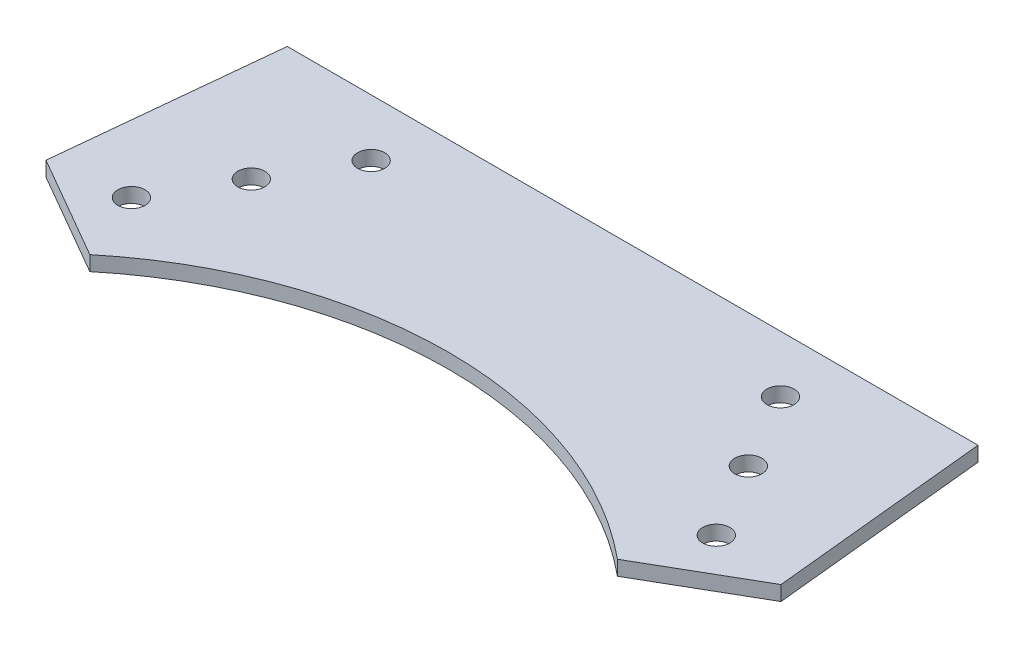
ISO-10303-21;
HEADER;
FILE_DESCRIPTION(('STEP AP214'),'2;1');
FILE_NAME('part.step','',(''),(''),'','','');
FILE_SCHEMA(('AUTOMOTIVE_DESIGN { 1 0 10303 214 1 1 1 1 }'));
ENDSEC;
DATA;
#1=APPLICATION_CONTEXT('core data for automotive mechanical design processes');
#2=APPLICATION_PROTOCOL_DEFINITION('international standard','automotive_design',2000,#1);
#3=PRODUCT_CONTEXT('',#1,'mechanical');
#4=PRODUCT('Part','Part','',(#3));
#5=PRODUCT_RELATED_PRODUCT_CATEGORY('part','',(#4));
#6=PRODUCT_DEFINITION_FORMATION('','',#4);
#7=PRODUCT_DEFINITION_CONTEXT('part definition',#1,'design');
#8=PRODUCT_DEFINITION('design','',#6,#7);
#9=PRODUCT_DEFINITION_SHAPE('','',#8);
#10=(LENGTH_UNIT() NAMED_UNIT(*) SI_UNIT(.MILLI.,.METRE.));
#11=(NAMED_UNIT(*) PLANE_ANGLE_UNIT() SI_UNIT($,.RADIAN.));
#12=(NAMED_UNIT(*) SI_UNIT($,.STERADIAN.) SOLID_ANGLE_UNIT());
#13=UNCERTAINTY_MEASURE_WITH_UNIT(LENGTH_MEASURE(1.E-05),#10,'distance_accuracy_value','');
#14=(GEOMETRIC_REPRESENTATION_CONTEXT(3) GLOBAL_UNCERTAINTY_ASSIGNED_CONTEXT((#13)) GLOBAL_UNIT_ASSIGNED_CONTEXT((#10,
#11,#12)) REPRESENTATION_CONTEXT('',''));
#15=CARTESIAN_POINT('',(0.,0.,0.));
#16=DIRECTION('',(0.,0.,1.));
#17=DIRECTION('',(1.,0.,0.));
#18=AXIS2_PLACEMENT_3D('',#15,#16,#17);
#19=CARTESIAN_POINT('',(-39.9050027505019,1.6,56.1174922400449));
#20=DIRECTION('',(0.994931471729192,0.,0.100555291073045));
#21=DIRECTION('',(0.100555291073045,0.,-0.994931471729192));
#22=AXIS2_PLACEMENT_3D('',#19,#20,#21);
#23=PLANE('',#22);
#24=DIRECTION('',(-0.100555291073045,0.,0.994931471729192));
#25=VECTOR('',#24,1.);
#26=CARTESIAN_POINT('',(-39.9050027505019,0.,56.1174922400449));
#27=LINE('',#26,#25);
#28=CARTESIAN_POINT('',(-37.5,0.,32.3215));
#29=VERTEX_POINT('',#28);
#30=CARTESIAN_POINT('',(-39.9050027505019,0.,56.1174922400449));
#31=VERTEX_POINT('',#30);
#32=EDGE_CURVE('E117',#29,#31,#27,.T.);
#33=ORIENTED_EDGE('',*,*,#32,.T.);
#34=DIRECTION('',(0.,-1.,0.));
#35=VECTOR('',#34,1.);
#36=CARTESIAN_POINT('',(-39.9050027505019,1.6,56.1174922400449));
#37=LINE('',#36,#35);
#38=CARTESIAN_POINT('',(-39.9050027505019,1.6,56.1174922400449));
#39=VERTEX_POINT('',#38);
#40=EDGE_CURVE('E11',#39,#31,#37,.T.);
#41=ORIENTED_EDGE('',*,*,#40,.F.);
#42=DIRECTION('',(-0.100555291073045,0.,0.994931471729192));
#43=VECTOR('',#42,1.);
#44=CARTESIAN_POINT('',(-39.9050027505019,1.6,56.1174922400449));
#45=LINE('',#44,#43);
#46=CARTESIAN_POINT('',(-37.5,1.6,32.3215));
#47=VERTEX_POINT('',#46);
#48=EDGE_CURVE('E128',#47,#39,#45,.T.);
#49=ORIENTED_EDGE('',*,*,#48,.F.);
#50=DIRECTION('',(0.,-1.,0.));
#51=VECTOR('',#50,1.);
#52=CARTESIAN_POINT('',(-37.5,1.6,32.3215));
#53=LINE('',#52,#51);
#54=EDGE_CURVE('E113',#47,#29,#53,.T.);
#55=ORIENTED_EDGE('',*,*,#54,.T.);
#56=EDGE_LOOP('',(#33,#41,#49,#55));
#57=FACE_BOUND('',#56,.T.);
#58=ADVANCED_FACE('F33',(#57),#23,.F.);
#59=CARTESIAN_POINT('',(-39.9050027505019,1.6,56.1174922400449));
#60=DIRECTION('',(0.500000000000001,0.,-0.866025403784438));
#61=DIRECTION('',(-0.866025403784438,0.,-0.500000000000001));
#62=AXIS2_PLACEMENT_3D('',#59,#60,#61);
#63=PLANE('',#62);
#64=DIRECTION('',(0.866025403784438,0.,0.500000000000001));
#65=VECTOR('',#64,1.);
#66=CARTESIAN_POINT('',(-39.9050027505019,0.,56.1174922400449));
#67=LINE('',#66,#65);
#68=CARTESIAN_POINT('',(-28.6466725013042,0.,62.617492240045));
#69=VERTEX_POINT('',#68);
#70=EDGE_CURVE('E120',#31,#69,#67,.T.);
#71=ORIENTED_EDGE('',*,*,#70,.T.);
#72=DIRECTION('',(0.,-1.,0.));
#73=VECTOR('',#72,1.);
#74=CARTESIAN_POINT('',(-28.6466725013042,1.6,62.617492240045));
#75=LINE('',#74,#73);
#76=CARTESIAN_POINT('',(-28.6466725013042,1.6,62.617492240045));
#77=VERTEX_POINT('',#76);
#78=EDGE_CURVE('E41',#77,#69,#75,.T.);
#79=ORIENTED_EDGE('',*,*,#78,.F.);
#80=DIRECTION('',(0.866025403784438,0.,0.500000000000001));
#81=VECTOR('',#80,1.);
#82=CARTESIAN_POINT('',(-39.9050027505019,1.6,56.1174922400449));
#83=LINE('',#82,#81);
#84=EDGE_CURVE('E86',#39,#77,#83,.T.);
#85=ORIENTED_EDGE('',*,*,#84,.F.);
#86=ORIENTED_EDGE('',*,*,#40,.T.);
#87=EDGE_LOOP('',(#71,#79,#85,#86));
#88=FACE_BOUND('',#87,.T.);
#89=ADVANCED_FACE('F153',(#88),#63,.F.);
#90=CARTESIAN_POINT('',(0.,1.6,97.3215));
#91=DIRECTION('',(0.,-1.,0.));
#92=DIRECTION('',(0.,0.,-1.));
#93=AXIS2_PLACEMENT_3D('',#90,#91,#92);
#94=CYLINDRICAL_SURFACE('',#93,45.);
#95=CARTESIAN_POINT('',(0.,0.,97.3215));
#96=DIRECTION('',(0.,-1.,0.));
#97=DIRECTION('',(0.,0.,-1.));
#98=AXIS2_PLACEMENT_3D('',#95,#96,#97);
#99=CIRCLE('',#98,45.);
#100=CARTESIAN_POINT('',(28.6466725013042,0.,62.617492240045));
#101=VERTEX_POINT('',#100);
#102=EDGE_CURVE('E123',#69,#101,#99,.T.);
#103=ORIENTED_EDGE('',*,*,#102,.T.);
#104=DIRECTION('',(0.,-1.,0.));
#105=VECTOR('',#104,1.);
#106=CARTESIAN_POINT('',(28.6466725013042,1.6,62.617492240045));
#107=LINE('',#106,#105);
#108=CARTESIAN_POINT('',(28.6466725013042,1.6,62.617492240045));
#109=VERTEX_POINT('',#108);
#110=EDGE_CURVE('E108',#109,#101,#107,.T.);
#111=ORIENTED_EDGE('',*,*,#110,.F.);
#112=CARTESIAN_POINT('',(0.,1.6,97.3215));
#113=DIRECTION('',(0.,-1.,0.));
#114=DIRECTION('',(0.,0.,-1.));
#115=AXIS2_PLACEMENT_3D('',#112,#113,#114);
#116=CIRCLE('',#115,45.);
#117=EDGE_CURVE('E99',#77,#109,#116,.T.);
#118=ORIENTED_EDGE('',*,*,#117,.F.);
#119=ORIENTED_EDGE('',*,*,#78,.T.);
#120=EDGE_LOOP('',(#103,#111,#118,#119));
#121=FACE_BOUND('',#120,.T.);
#122=ADVANCED_FACE('F134',(#121),#94,.F.);
#123=CARTESIAN_POINT('',(39.9050027505019,1.6,56.1174922400449));
#124=DIRECTION('',(-0.500000000000001,0.,-0.866025403784438));
#125=DIRECTION('',(-0.866025403784438,0.,0.500000000000001));
#126=AXIS2_PLACEMENT_3D('',#123,#124,#125);
#127=PLANE('',#126);
#128=DIRECTION('',(0.866025403784438,0.,-0.500000000000001));
#129=VECTOR('',#128,1.);
#130=CARTESIAN_POINT('',(39.9050027505019,0.,56.1174922400449));
#131=LINE('',#130,#129);
#132=CARTESIAN_POINT('',(39.9050027505019,0.,56.1174922400449));
#133=VERTEX_POINT('',#132);
#134=EDGE_CURVE('E107',#101,#133,#131,.T.);
#135=ORIENTED_EDGE('',*,*,#134,.T.);
#136=DIRECTION('',(0.,-1.,0.));
#137=VECTOR('',#136,1.);
#138=CARTESIAN_POINT('',(39.9050027505019,1.6,56.1174922400449));
#139=LINE('',#138,#137);
#140=CARTESIAN_POINT('',(39.9050027505019,1.6,56.1174922400449));
#141=VERTEX_POINT('',#140);
#142=EDGE_CURVE('E104',#141,#133,#139,.T.);
#143=ORIENTED_EDGE('',*,*,#142,.F.);
#144=DIRECTION('',(0.866025403784438,0.,-0.500000000000001));
#145=VECTOR('',#144,1.);
#146=CARTESIAN_POINT('',(39.9050027505019,1.6,56.1174922400449));
#147=LINE('',#146,#145);
#148=EDGE_CURVE('E93',#109,#141,#147,.T.);
#149=ORIENTED_EDGE('',*,*,#148,.F.);
#150=ORIENTED_EDGE('',*,*,#110,.T.);
#151=EDGE_LOOP('',(#135,#143,#149,#150));
#152=FACE_BOUND('',#151,.T.);
#153=ADVANCED_FACE('F105',(#152),#127,.F.);
#154=CARTESIAN_POINT('',(39.9050027505019,1.6,56.1174922400449));
#155=DIRECTION('',(-0.994931471729192,0.,0.100555291073045));
#156=DIRECTION('',(0.100555291073045,0.,0.994931471729192));
#157=AXIS2_PLACEMENT_3D('',#154,#155,#156);
#158=PLANE('',#157);
#159=DIRECTION('',(-0.100555291073045,0.,-0.994931471729192));
#160=VECTOR('',#159,1.);
#161=CARTESIAN_POINT('',(39.9050027505019,0.,56.1174922400449));
#162=LINE('',#161,#160);
#163=CARTESIAN_POINT('',(37.5,0.,32.3215));
#164=VERTEX_POINT('',#163);
#165=EDGE_CURVE('E72',#133,#164,#162,.T.);
#166=ORIENTED_EDGE('',*,*,#165,.T.);
#167=DIRECTION('',(0.,-1.,0.));
#168=VECTOR('',#167,1.);
#169=CARTESIAN_POINT('',(37.5,1.6,32.3215));
#170=LINE('',#169,#168);
#171=CARTESIAN_POINT('',(37.5,1.6,32.3215));
#172=VERTEX_POINT('',#171);
#173=EDGE_CURVE('E109',#172,#164,#170,.T.);
#174=ORIENTED_EDGE('',*,*,#173,.F.);
#175=DIRECTION('',(-0.100555291073045,0.,-0.994931471729192));
#176=VECTOR('',#175,1.);
#177=CARTESIAN_POINT('',(39.9050027505019,1.6,56.1174922400449));
#178=LINE('',#177,#176);
#179=EDGE_CURVE('E97',#141,#172,#178,.T.);
#180=ORIENTED_EDGE('',*,*,#179,.F.);
#181=ORIENTED_EDGE('',*,*,#142,.T.);
#182=EDGE_LOOP('',(#166,#174,#180,#181));
#183=FACE_BOUND('',#182,.T.);
#184=ADVANCED_FACE('F111',(#183),#158,.F.);
#185=CARTESIAN_POINT('',(-37.5,1.6,32.3215));
#186=DIRECTION('',(0.,0.,1.));
#187=DIRECTION('',(1.,0.,0.));
#188=AXIS2_PLACEMENT_3D('',#185,#186,#187);
#189=PLANE('',#188);
#190=DIRECTION('',(-1.,0.,0.));
#191=VECTOR('',#190,1.);
#192=CARTESIAN_POINT('',(-37.5,0.,32.3215));
#193=LINE('',#192,#191);
#194=EDGE_CURVE('E78',#164,#29,#193,.T.);
#195=ORIENTED_EDGE('',*,*,#194,.T.);
#196=ORIENTED_EDGE('',*,*,#54,.F.);
#197=DIRECTION('',(-1.,0.,0.));
#198=VECTOR('',#197,1.);
#199=CARTESIAN_POINT('',(-37.5,1.6,32.3215));
#200=LINE('',#199,#198);
#201=EDGE_CURVE('E49',#172,#47,#200,.T.);
#202=ORIENTED_EDGE('',*,*,#201,.F.);
#203=ORIENTED_EDGE('',*,*,#173,.T.);
#204=EDGE_LOOP('',(#195,#196,#202,#203));
#205=FACE_BOUND('',#204,.T.);
#206=ADVANCED_FACE('F141',(#205),#189,.F.);
#207=CARTESIAN_POINT('',(0.,1.6,97.3215));
#208=DIRECTION('',(0.,-1.,0.));
#209=DIRECTION('',(0.,0.,-1.));
#210=AXIS2_PLACEMENT_3D('',#207,#208,#209);
#211=PLANE('',#210);
#212=CARTESIAN_POINT('',(-22.2250000000001,1.6,38.4948291982183));
#213=DIRECTION('',(0.,1.,0.));
#214=DIRECTION('',(0.,0.,1.));
#215=AXIS2_PLACEMENT_3D('',#212,#213,#214);
#216=CIRCLE('',#215,1.47319999999999);
#217=CARTESIAN_POINT('',(-22.2250000000001,1.6,39.9680291982183));
#218=VERTEX_POINT('',#217);
#219=EDGE_CURVE('E259',#218,#218,#216,.T.);
#220=ORIENTED_EDGE('',*,*,#219,.F.);
#221=EDGE_LOOP('',(#220));
#222=FACE_BOUND('',#221,.T.);
#223=CARTESIAN_POINT('',(-26.9875000000001,1.6,46.743721169265));
#224=DIRECTION('',(0.,1.,0.));
#225=DIRECTION('',(0.,0.,1.));
#226=AXIS2_PLACEMENT_3D('',#223,#224,#225);
#227=CIRCLE('',#226,1.47319999999999);
#228=CARTESIAN_POINT('',(-26.9875000000001,1.6,48.216921169265));
#229=VERTEX_POINT('',#228);
#230=EDGE_CURVE('E261',#229,#229,#227,.T.);
#231=ORIENTED_EDGE('',*,*,#230,.F.);
#232=EDGE_LOOP('',(#231));
#233=FACE_BOUND('',#232,.T.);
#234=CARTESIAN_POINT('',(-31.7500000000001,1.6,54.9926131403118));
#235=DIRECTION('',(0.,1.,0.));
#236=DIRECTION('',(0.,0.,1.));
#237=AXIS2_PLACEMENT_3D('',#234,#235,#236);
#238=CIRCLE('',#237,1.47319999999999);
#239=CARTESIAN_POINT('',(-31.7500000000001,1.6,56.4658131403118));
#240=VERTEX_POINT('',#239);
#241=EDGE_CURVE('E269',#240,#240,#238,.T.);
#242=ORIENTED_EDGE('',*,*,#241,.F.);
#243=EDGE_LOOP('',(#242));
#244=FACE_BOUND('',#243,.T.);
#245=CARTESIAN_POINT('',(22.2250000000001,1.6,38.4948291982183));
#246=DIRECTION('',(0.,1.,0.));
#247=DIRECTION('',(0.,0.,1.));
#248=AXIS2_PLACEMENT_3D('',#245,#246,#247);
#249=CIRCLE('',#248,1.47319999999999);
#250=CARTESIAN_POINT('',(22.2250000000001,1.6,39.9680291982183));
#251=VERTEX_POINT('',#250);
#252=EDGE_CURVE('E275',#251,#251,#249,.T.);
#253=ORIENTED_EDGE('',*,*,#252,.F.);
#254=EDGE_LOOP('',(#253));
#255=FACE_BOUND('',#254,.T.);
#256=CARTESIAN_POINT('',(26.9875000000001,1.6,46.743721169265));
#257=DIRECTION('',(0.,1.,0.));
#258=DIRECTION('',(0.,0.,1.));
#259=AXIS2_PLACEMENT_3D('',#256,#257,#258);
#260=CIRCLE('',#259,1.47319999999999);
#261=CARTESIAN_POINT('',(26.9875000000001,1.6,48.216921169265));
#262=VERTEX_POINT('',#261);
#263=EDGE_CURVE('E281',#262,#262,#260,.T.);
#264=ORIENTED_EDGE('',*,*,#263,.F.);
#265=EDGE_LOOP('',(#264));
#266=FACE_BOUND('',#265,.T.);
#267=CARTESIAN_POINT('',(31.7500000000001,1.6,54.9926131403118));
#268=DIRECTION('',(0.,1.,0.));
#269=DIRECTION('',(0.,0.,1.));
#270=AXIS2_PLACEMENT_3D('',#267,#268,#269);
#271=CIRCLE('',#270,1.47319999999999);
#272=CARTESIAN_POINT('',(31.7500000000001,1.6,56.4658131403118));
#273=VERTEX_POINT('',#272);
#274=EDGE_CURVE('E287',#273,#273,#271,.T.);
#275=ORIENTED_EDGE('',*,*,#274,.F.);
#276=EDGE_LOOP('',(#275));
#277=FACE_BOUND('',#276,.T.);
#278=ORIENTED_EDGE('',*,*,#48,.T.);
#279=ORIENTED_EDGE('',*,*,#84,.T.);
#280=ORIENTED_EDGE('',*,*,#117,.T.);
#281=ORIENTED_EDGE('',*,*,#148,.T.);
#282=ORIENTED_EDGE('',*,*,#179,.T.);
#283=ORIENTED_EDGE('',*,*,#201,.T.);
#284=EDGE_LOOP('',(#278,#279,#280,#281,#282,#283));
#285=FACE_BOUND('',#284,.T.);
#286=ADVANCED_FACE('F95',(#222,#233,#244,#255,#266,#277,#285),#211,.F.);
#287=CARTESIAN_POINT('',(0.,0.,97.3215));
#288=DIRECTION('',(0.,-1.,0.));
#289=DIRECTION('',(0.,0.,-1.));
#290=AXIS2_PLACEMENT_3D('',#287,#288,#289);
#291=PLANE('',#290);
#292=CARTESIAN_POINT('',(-22.2250000000001,0.,38.4948291982183));
#293=DIRECTION('',(0.,1.,0.));
#294=DIRECTION('',(0.,0.,1.));
#295=AXIS2_PLACEMENT_3D('',#292,#293,#294);
#296=CIRCLE('',#295,1.47319999999998);
#297=CARTESIAN_POINT('',(-22.2250000000001,0.,39.9680291982182));
#298=VERTEX_POINT('',#297);
#299=EDGE_CURVE('E256',#298,#298,#296,.T.);
#300=ORIENTED_EDGE('',*,*,#299,.T.);
#301=EDGE_LOOP('',(#300));
#302=FACE_BOUND('',#301,.T.);
#303=CARTESIAN_POINT('',(-26.9875000000001,0.,46.743721169265));
#304=DIRECTION('',(0.,1.,0.));
#305=DIRECTION('',(0.,0.,1.));
#306=AXIS2_PLACEMENT_3D('',#303,#304,#305);
#307=CIRCLE('',#306,1.47319999999998);
#308=CARTESIAN_POINT('',(-26.9875000000001,0.,48.216921169265));
#309=VERTEX_POINT('',#308);
#310=EDGE_CURVE('E266',#309,#309,#307,.T.);
#311=ORIENTED_EDGE('',*,*,#310,.T.);
#312=EDGE_LOOP('',(#311));
#313=FACE_BOUND('',#312,.T.);
#314=CARTESIAN_POINT('',(-31.7500000000001,0.,54.9926131403118));
#315=DIRECTION('',(0.,1.,0.));
#316=DIRECTION('',(0.,0.,1.));
#317=AXIS2_PLACEMENT_3D('',#314,#315,#316);
#318=CIRCLE('',#317,1.47319999999998);
#319=CARTESIAN_POINT('',(-31.7500000000001,0.,56.4658131403118));
#320=VERTEX_POINT('',#319);
#321=EDGE_CURVE('E272',#320,#320,#318,.T.);
#322=ORIENTED_EDGE('',*,*,#321,.T.);
#323=EDGE_LOOP('',(#322));
#324=FACE_BOUND('',#323,.T.);
#325=CARTESIAN_POINT('',(22.2250000000001,0.,38.4948291982183));
#326=DIRECTION('',(0.,1.,0.));
#327=DIRECTION('',(0.,0.,1.));
#328=AXIS2_PLACEMENT_3D('',#325,#326,#327);
#329=CIRCLE('',#328,1.47319999999998);
#330=CARTESIAN_POINT('',(22.2250000000001,0.,39.9680291982182));
#331=VERTEX_POINT('',#330);
#332=EDGE_CURVE('E278',#331,#331,#329,.T.);
#333=ORIENTED_EDGE('',*,*,#332,.T.);
#334=EDGE_LOOP('',(#333));
#335=FACE_BOUND('',#334,.T.);
#336=CARTESIAN_POINT('',(26.9875000000001,0.,46.743721169265));
#337=DIRECTION('',(0.,1.,0.));
#338=DIRECTION('',(0.,0.,1.));
#339=AXIS2_PLACEMENT_3D('',#336,#337,#338);
#340=CIRCLE('',#339,1.47319999999998);
#341=CARTESIAN_POINT('',(26.9875000000001,0.,48.216921169265));
#342=VERTEX_POINT('',#341);
#343=EDGE_CURVE('E284',#342,#342,#340,.T.);
#344=ORIENTED_EDGE('',*,*,#343,.T.);
#345=EDGE_LOOP('',(#344));
#346=FACE_BOUND('',#345,.T.);
#347=CARTESIAN_POINT('',(31.7500000000001,0.,54.9926131403118));
#348=DIRECTION('',(0.,1.,0.));
#349=DIRECTION('',(0.,0.,1.));
#350=AXIS2_PLACEMENT_3D('',#347,#348,#349);
#351=CIRCLE('',#350,1.47319999999999);
#352=CARTESIAN_POINT('',(31.7500000000001,0.,56.4658131403118));
#353=VERTEX_POINT('',#352);
#354=EDGE_CURVE('E121',#353,#353,#351,.T.);
#355=ORIENTED_EDGE('',*,*,#354,.T.);
#356=EDGE_LOOP('',(#355));
#357=FACE_BOUND('',#356,.T.);
#358=ORIENTED_EDGE('',*,*,#32,.F.);
#359=ORIENTED_EDGE('',*,*,#194,.F.);
#360=ORIENTED_EDGE('',*,*,#165,.F.);
#361=ORIENTED_EDGE('',*,*,#134,.F.);
#362=ORIENTED_EDGE('',*,*,#102,.F.);
#363=ORIENTED_EDGE('',*,*,#70,.F.);
#364=EDGE_LOOP('',(#358,#359,#360,#361,#362,#363));
#365=FACE_BOUND('',#364,.T.);
#366=ADVANCED_FACE('F137',(#302,#313,#324,#335,#346,#357,#365),#291,.T.);
#367=CARTESIAN_POINT('',(31.7500000000001,1.6,54.9926131403118));
#368=DIRECTION('',(0.,1.,0.));
#369=DIRECTION('',(0.,0.,1.));
#370=AXIS2_PLACEMENT_3D('',#367,#368,#369);
#371=CYLINDRICAL_SURFACE('',#370,1.47319999999999);
#372=ORIENTED_EDGE('',*,*,#354,.F.);
#373=EDGE_LOOP('',(#372));
#374=FACE_BOUND('',#373,.T.);
#375=ORIENTED_EDGE('',*,*,#274,.T.);
#376=EDGE_LOOP('',(#375));
#377=FACE_BOUND('',#376,.T.);
#378=ADVANCED_FACE('F181',(#374,#377),#371,.F.);
#379=CARTESIAN_POINT('',(26.9875000000001,1.6,46.743721169265));
#380=DIRECTION('',(0.,1.,0.));
#381=DIRECTION('',(0.,0.,1.));
#382=AXIS2_PLACEMENT_3D('',#379,#380,#381);
#383=CYLINDRICAL_SURFACE('',#382,1.47319999999999);
#384=ORIENTED_EDGE('',*,*,#343,.F.);
#385=EDGE_LOOP('',(#384));
#386=FACE_BOUND('',#385,.T.);
#387=ORIENTED_EDGE('',*,*,#263,.T.);
#388=EDGE_LOOP('',(#387));
#389=FACE_BOUND('',#388,.T.);
#390=ADVANCED_FACE('F186',(#386,#389),#383,.F.);
#391=CARTESIAN_POINT('',(22.2250000000001,1.6,38.4948291982183));
#392=DIRECTION('',(0.,1.,0.));
#393=DIRECTION('',(0.,0.,1.));
#394=AXIS2_PLACEMENT_3D('',#391,#392,#393);
#395=CYLINDRICAL_SURFACE('',#394,1.47319999999999);
#396=ORIENTED_EDGE('',*,*,#332,.F.);
#397=EDGE_LOOP('',(#396));
#398=FACE_BOUND('',#397,.T.);
#399=ORIENTED_EDGE('',*,*,#252,.T.);
#400=EDGE_LOOP('',(#399));
#401=FACE_BOUND('',#400,.T.);
#402=ADVANCED_FACE('F198',(#398,#401),#395,.F.);
#403=CARTESIAN_POINT('',(-31.7500000000001,1.6,54.9926131403118));
#404=DIRECTION('',(0.,1.,0.));
#405=DIRECTION('',(0.,0.,1.));
#406=AXIS2_PLACEMENT_3D('',#403,#404,#405);
#407=CYLINDRICAL_SURFACE('',#406,1.47319999999999);
#408=ORIENTED_EDGE('',*,*,#321,.F.);
#409=EDGE_LOOP('',(#408));
#410=FACE_BOUND('',#409,.T.);
#411=ORIENTED_EDGE('',*,*,#241,.T.);
#412=EDGE_LOOP('',(#411));
#413=FACE_BOUND('',#412,.T.);
#414=ADVANCED_FACE('F208',(#410,#413),#407,.F.);
#415=CARTESIAN_POINT('',(-26.9875000000001,1.6,46.743721169265));
#416=DIRECTION('',(0.,1.,0.));
#417=DIRECTION('',(0.,0.,1.));
#418=AXIS2_PLACEMENT_3D('',#415,#416,#417);
#419=CYLINDRICAL_SURFACE('',#418,1.47319999999999);
#420=ORIENTED_EDGE('',*,*,#310,.F.);
#421=EDGE_LOOP('',(#420));
#422=FACE_BOUND('',#421,.T.);
#423=ORIENTED_EDGE('',*,*,#230,.T.);
#424=EDGE_LOOP('',(#423));
#425=FACE_BOUND('',#424,.T.);
#426=ADVANCED_FACE('F229',(#422,#425),#419,.F.);
#427=CARTESIAN_POINT('',(-22.2250000000001,1.6,38.4948291982183));
#428=DIRECTION('',(0.,1.,0.));
#429=DIRECTION('',(0.,0.,1.));
#430=AXIS2_PLACEMENT_3D('',#427,#428,#429);
#431=CYLINDRICAL_SURFACE('',#430,1.47319999999999);
#432=ORIENTED_EDGE('',*,*,#299,.F.);
#433=EDGE_LOOP('',(#432));
#434=FACE_BOUND('',#433,.T.);
#435=ORIENTED_EDGE('',*,*,#219,.T.);
#436=EDGE_LOOP('',(#435));
#437=FACE_BOUND('',#436,.T.);
#438=ADVANCED_FACE('F239',(#434,#437),#431,.F.);
#439=CLOSED_SHELL('',(#58,#89,#122,#153,#184,#206,#286,#366,#378,#390,#402,#414,#426,#438));
#440=MANIFOLD_SOLID_BREP('B2',#439);
#441=ADVANCED_BREP_SHAPE_REPRESENTATION('',(#18,#440),#14);
#442=SHAPE_DEFINITION_REPRESENTATION(#9,#441);
ENDSEC;
END-ISO-10303-21;
